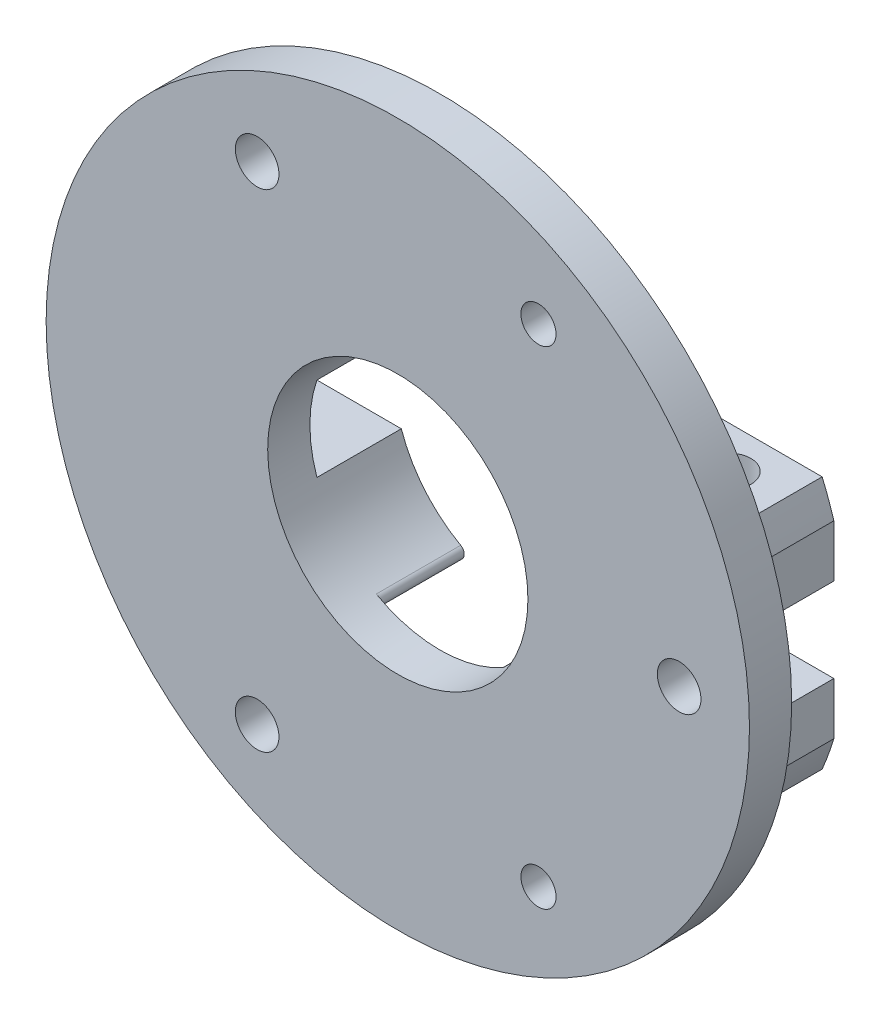
ISO-10303-21;
HEADER;
FILE_DESCRIPTION(('STEP AP214'),'2;1');
FILE_NAME('part.step','',(''),(''),'','','');
FILE_SCHEMA(('AUTOMOTIVE_DESIGN { 1 0 10303 214 1 1 1 1 }'));
ENDSEC;
DATA;
#1=APPLICATION_CONTEXT('core data for automotive mechanical design processes');
#2=APPLICATION_PROTOCOL_DEFINITION('international standard','automotive_design',2000,#1);
#3=PRODUCT_CONTEXT('',#1,'mechanical');
#4=PRODUCT('Part','Part','',(#3));
#5=PRODUCT_RELATED_PRODUCT_CATEGORY('part','',(#4));
#6=PRODUCT_DEFINITION_FORMATION('','',#4);
#7=PRODUCT_DEFINITION_CONTEXT('part definition',#1,'design');
#8=PRODUCT_DEFINITION('design','',#6,#7);
#9=PRODUCT_DEFINITION_SHAPE('','',#8);
#10=(LENGTH_UNIT() NAMED_UNIT(*) SI_UNIT(.MILLI.,.METRE.));
#11=(NAMED_UNIT(*) PLANE_ANGLE_UNIT() SI_UNIT($,.RADIAN.));
#12=(NAMED_UNIT(*) SI_UNIT($,.STERADIAN.) SOLID_ANGLE_UNIT());
#13=UNCERTAINTY_MEASURE_WITH_UNIT(LENGTH_MEASURE(1.E-05),#10,'distance_accuracy_value','');
#14=(GEOMETRIC_REPRESENTATION_CONTEXT(3) GLOBAL_UNCERTAINTY_ASSIGNED_CONTEXT((#13)) GLOBAL_UNIT_ASSIGNED_CONTEXT((#10,
#11,#12)) REPRESENTATION_CONTEXT('',''));
#15=CARTESIAN_POINT('',(0.,0.,0.));
#16=DIRECTION('',(0.,0.,1.));
#17=DIRECTION('',(1.,0.,0.));
#18=AXIS2_PLACEMENT_3D('',#15,#16,#17);
#19=CARTESIAN_POINT('',(0.,0.,0.));
#20=DIRECTION('',(0.,0.,1.));
#21=DIRECTION('',(1.,0.,0.));
#22=AXIS2_PLACEMENT_3D('',#19,#20,#21);
#23=PLANE('',#22);
#24=CARTESIAN_POINT('',(0.,0.,0.));
#25=DIRECTION('',(0.,0.,1.));
#26=DIRECTION('',(1.,0.,0.));
#27=AXIS2_PLACEMENT_3D('',#24,#25,#26);
#28=CIRCLE('',#27,9.25);
#29=CARTESIAN_POINT('',(8.7500000000059,-2.99999999998279,0.));
#30=VERTEX_POINT('',#29);
#31=CARTESIAN_POINT('',(8.7499999999939,3.00000000001778,0.));
#32=VERTEX_POINT('',#31);
#33=EDGE_CURVE('E381',#30,#32,#28,.T.);
#34=ORIENTED_EDGE('',*,*,#33,.T.);
#35=DIRECTION('',(-1.,0.,0.));
#36=VECTOR('',#35,1.);
#37=CARTESIAN_POINT('',(0.,3.00000000001778,0.));
#38=LINE('',#37,#36);
#39=CARTESIAN_POINT('',(21.9999999999959,3.00000000001778,0.));
#40=VERTEX_POINT('',#39);
#41=EDGE_CURVE('E211',#40,#32,#38,.T.);
#42=ORIENTED_EDGE('',*,*,#41,.F.);
#43=DIRECTION('',(0.,-1.,0.));
#44=VECTOR('',#43,1.);
#45=CARTESIAN_POINT('',(21.9999999999959,0.,0.));
#46=LINE('',#45,#44);
#47=CARTESIAN_POINT('',(21.9999999999959,6.70820393251295,0.));
#48=VERTEX_POINT('',#47);
#49=EDGE_CURVE('E204',#48,#40,#46,.T.);
#50=ORIENTED_EDGE('',*,*,#49,.F.);
#51=CARTESIAN_POINT('',(0.,0.,0.));
#52=DIRECTION('',(0.,0.,1.));
#53=DIRECTION('',(1.,0.,0.));
#54=AXIS2_PLACEMENT_3D('',#51,#52,#53);
#55=CIRCLE('',#54,23.);
#56=CARTESIAN_POINT('',(21.1660104885105,9.00000000001463,0.));
#57=VERTEX_POINT('',#56);
#58=EDGE_CURVE('E210',#48,#57,#55,.T.);
#59=ORIENTED_EDGE('',*,*,#58,.T.);
#60=DIRECTION('',(1.,0.,0.));
#61=VECTOR('',#60,1.);
#62=CARTESIAN_POINT('',(0.,9.00000000001463,0.));
#63=LINE('',#62,#61);
#64=CARTESIAN_POINT('',(4.77624329360967,9.00000000001463,0.));
#65=VERTEX_POINT('',#64);
#66=EDGE_CURVE('E366',#65,#57,#63,.T.);
#67=ORIENTED_EDGE('',*,*,#66,.F.);
#68=CARTESIAN_POINT('',(4.77624329360967,8.50000000001463,0.));
#69=DIRECTION('',(0.,0.,1.));
#70=DIRECTION('',(1.,0.,0.));
#71=AXIS2_PLACEMENT_3D('',#68,#69,#70);
#72=CIRCLE('',#71,0.5);
#73=CARTESIAN_POINT('',(4.53130774009123,8.06410256411644,0.));
#74=VERTEX_POINT('',#73);
#75=EDGE_CURVE('E51',#65,#74,#72,.T.);
#76=ORIENTED_EDGE('',*,*,#75,.T.);
#77=CARTESIAN_POINT('',(-4.53130774009123,8.06410256411644,0.));
#78=VERTEX_POINT('',#77);
#79=EDGE_CURVE('E384',#74,#78,#28,.T.);
#80=ORIENTED_EDGE('',*,*,#79,.T.);
#81=CARTESIAN_POINT('',(-4.77624329360967,8.50000000001463,0.));
#82=DIRECTION('',(0.,0.,1.));
#83=DIRECTION('',(1.,0.,0.));
#84=AXIS2_PLACEMENT_3D('',#81,#82,#83);
#85=CIRCLE('',#84,0.5);
#86=CARTESIAN_POINT('',(-4.77624329360967,9.00000000001463,0.));
#87=VERTEX_POINT('',#86);
#88=EDGE_CURVE('E423',#78,#87,#85,.T.);
#89=ORIENTED_EDGE('',*,*,#88,.T.);
#90=DIRECTION('',(1.,0.,0.));
#91=VECTOR('',#90,1.);
#92=CARTESIAN_POINT('',(0.,9.00000000001463,0.));
#93=LINE('',#92,#91);
#94=CARTESIAN_POINT('',(-21.1660104885105,9.00000000001463,0.));
#95=VERTEX_POINT('',#94);
#96=EDGE_CURVE('E345',#95,#87,#93,.T.);
#97=ORIENTED_EDGE('',*,*,#96,.F.);
#98=CARTESIAN_POINT('',(-22.0000000000035,6.70820393248783,0.));
#99=VERTEX_POINT('',#98);
#100=EDGE_CURVE('E234',#95,#99,#55,.T.);
#101=ORIENTED_EDGE('',*,*,#100,.T.);
#102=DIRECTION('',(0.,-1.,0.));
#103=VECTOR('',#102,1.);
#104=CARTESIAN_POINT('',(-22.0000000000035,0.,0.));
#105=LINE('',#104,#103);
#106=CARTESIAN_POINT('',(-22.0000000000035,3.00000000001778,0.));
#107=VERTEX_POINT('',#106);
#108=EDGE_CURVE('E355',#99,#107,#105,.T.);
#109=ORIENTED_EDGE('',*,*,#108,.T.);
#110=DIRECTION('',(-1.,0.,0.));
#111=VECTOR('',#110,1.);
#112=CARTESIAN_POINT('',(0.,3.00000000001778,0.));
#113=LINE('',#112,#111);
#114=CARTESIAN_POINT('',(-8.7499999999939,3.00000000001778,0.));
#115=VERTEX_POINT('',#114);
#116=EDGE_CURVE('E341',#115,#107,#113,.T.);
#117=ORIENTED_EDGE('',*,*,#116,.F.);
#118=CARTESIAN_POINT('',(-8.7500000000059,-2.99999999998279,0.));
#119=VERTEX_POINT('',#118);
#120=EDGE_CURVE('E386',#115,#119,#28,.T.);
#121=ORIENTED_EDGE('',*,*,#120,.T.);
#122=DIRECTION('',(-1.,0.,0.));
#123=VECTOR('',#122,1.);
#124=CARTESIAN_POINT('',(0.,-2.99999999998279,0.));
#125=LINE('',#124,#123);
#126=CARTESIAN_POINT('',(-22.0000000000035,-2.99999999998279,0.));
#127=VERTEX_POINT('',#126);
#128=EDGE_CURVE('E320',#119,#127,#125,.T.);
#129=ORIENTED_EDGE('',*,*,#128,.T.);
#130=DIRECTION('',(0.,-1.,0.));
#131=VECTOR('',#130,1.);
#132=CARTESIAN_POINT('',(-22.0000000000035,0.,0.));
#133=LINE('',#132,#131);
#134=CARTESIAN_POINT('',(-22.0000000000035,-6.70820393248783,0.));
#135=VERTEX_POINT('',#134);
#136=EDGE_CURVE('E332',#127,#135,#133,.T.);
#137=ORIENTED_EDGE('',*,*,#136,.T.);
#138=CARTESIAN_POINT('',(-21.1660104885235,-8.99999999998418,0.));
#139=VERTEX_POINT('',#138);
#140=EDGE_CURVE('E231',#135,#139,#55,.T.);
#141=ORIENTED_EDGE('',*,*,#140,.T.);
#142=DIRECTION('',(1.,0.,0.));
#143=VECTOR('',#142,1.);
#144=CARTESIAN_POINT('',(0.,-8.99999999998418,0.));
#145=LINE('',#144,#143);
#146=CARTESIAN_POINT('',(-4.77624329366386,-8.99999999998418,0.));
#147=VERTEX_POINT('',#146);
#148=EDGE_CURVE('E316',#139,#147,#145,.T.);
#149=ORIENTED_EDGE('',*,*,#148,.T.);
#150=CARTESIAN_POINT('',(-4.77624329366386,-8.49999999998418,0.));
#151=DIRECTION('',(0.,0.,1.));
#152=DIRECTION('',(1.,0.,0.));
#153=AXIS2_PLACEMENT_3D('',#150,#151,#152);
#154=CIRCLE('',#153,0.5);
#155=CARTESIAN_POINT('',(-4.53130774014263,-8.06410256408755,0.));
#156=VERTEX_POINT('',#155);
#157=EDGE_CURVE('E420',#147,#156,#154,.T.);
#158=ORIENTED_EDGE('',*,*,#157,.T.);
#159=CARTESIAN_POINT('',(4.53130774014263,-8.06410256408755,0.));
#160=VERTEX_POINT('',#159);
#161=EDGE_CURVE('E445',#156,#160,#28,.T.);
#162=ORIENTED_EDGE('',*,*,#161,.T.);
#163=CARTESIAN_POINT('',(4.77624329366386,-8.49999999998418,0.));
#164=DIRECTION('',(0.,0.,1.));
#165=DIRECTION('',(1.,0.,0.));
#166=AXIS2_PLACEMENT_3D('',#163,#164,#165);
#167=CIRCLE('',#166,0.5);
#168=CARTESIAN_POINT('',(4.77624329366386,-8.99999999998418,0.));
#169=VERTEX_POINT('',#168);
#170=EDGE_CURVE('E418',#160,#169,#167,.T.);
#171=ORIENTED_EDGE('',*,*,#170,.T.);
#172=DIRECTION('',(1.,0.,0.));
#173=VECTOR('',#172,1.);
#174=CARTESIAN_POINT('',(0.,-8.99999999998418,0.));
#175=LINE('',#174,#173);
#176=CARTESIAN_POINT('',(21.1660104885235,-8.99999999998418,0.));
#177=VERTEX_POINT('',#176);
#178=EDGE_CURVE('E253',#169,#177,#175,.T.);
#179=ORIENTED_EDGE('',*,*,#178,.T.);
#180=CARTESIAN_POINT('',(21.9999999999959,-6.70820393251295,0.));
#181=VERTEX_POINT('',#180);
#182=EDGE_CURVE('E236',#177,#181,#55,.T.);
#183=ORIENTED_EDGE('',*,*,#182,.T.);
#184=DIRECTION('',(0.,-1.,0.));
#185=VECTOR('',#184,1.);
#186=CARTESIAN_POINT('',(21.9999999999959,0.,0.));
#187=LINE('',#186,#185);
#188=CARTESIAN_POINT('',(21.9999999999959,-2.99999999998279,0.));
#189=VERTEX_POINT('',#188);
#190=EDGE_CURVE('E250',#189,#181,#187,.T.);
#191=ORIENTED_EDGE('',*,*,#190,.F.);
#192=DIRECTION('',(-1.,0.,0.));
#193=VECTOR('',#192,1.);
#194=CARTESIAN_POINT('',(0.,-2.99999999998279,0.));
#195=LINE('',#194,#193);
#196=EDGE_CURVE('E298',#189,#30,#195,.T.);
#197=ORIENTED_EDGE('',*,*,#196,.T.);
#198=EDGE_LOOP('',(#34,#42,#50,#59,#67,#76,#80,#89,#97,#101,#109,#117,#121,#129,#137,#141,#149,
#158,#162,#171,#179,#183,#191,#197));
#199=FACE_BOUND('',#198,.T.);
#200=CARTESIAN_POINT('',(20.,0.,0.));
#201=DIRECTION('',(0.,0.,-1.));
#202=DIRECTION('',(-1.,0.,0.));
#203=AXIS2_PLACEMENT_3D('',#200,#201,#202);
#204=CIRCLE('',#203,1.55);
#205=CARTESIAN_POINT('',(18.45,0.,0.));
#206=VERTEX_POINT('',#205);
#207=EDGE_CURVE('E606',#206,#206,#204,.T.);
#208=ORIENTED_EDGE('',*,*,#207,.F.);
#209=EDGE_LOOP('',(#208));
#210=FACE_BOUND('',#209,.T.);
#211=CARTESIAN_POINT('',(9.99999999999984,-17.3205080756889,0.));
#212=DIRECTION('',(0.,0.,-1.));
#213=DIRECTION('',(-1.,0.,0.));
#214=AXIS2_PLACEMENT_3D('',#211,#212,#213);
#215=CIRCLE('',#214,1.24999999999999);
#216=CARTESIAN_POINT('',(8.74999999999985,-17.3205080756889,0.));
#217=VERTEX_POINT('',#216);
#218=EDGE_CURVE('E600',#217,#217,#215,.T.);
#219=ORIENTED_EDGE('',*,*,#218,.F.);
#220=EDGE_LOOP('',(#219));
#221=FACE_BOUND('',#220,.T.);
#222=CARTESIAN_POINT('',(0.,0.,0.));
#223=DIRECTION('',(0.,0.,1.));
#224=DIRECTION('',(1.,0.,0.));
#225=AXIS2_PLACEMENT_3D('',#222,#223,#224);
#226=CIRCLE('',#225,25.);
#227=CARTESIAN_POINT('',(25.,0.,0.));
#228=VERTEX_POINT('',#227);
#229=EDGE_CURVE('E238',#228,#228,#226,.T.);
#230=ORIENTED_EDGE('',*,*,#229,.F.);
#231=EDGE_LOOP('',(#230));
#232=FACE_BOUND('',#231,.T.);
#233=CARTESIAN_POINT('',(-10.0000000000001,17.3205080756887,0.));
#234=DIRECTION('',(0.,0.,-1.));
#235=DIRECTION('',(-1.,0.,0.));
#236=AXIS2_PLACEMENT_3D('',#233,#234,#235);
#237=CIRCLE('',#236,1.55);
#238=CARTESIAN_POINT('',(-11.5500000000001,17.3205080756887,0.));
#239=VERTEX_POINT('',#238);
#240=EDGE_CURVE('E593',#239,#239,#237,.T.);
#241=ORIENTED_EDGE('',*,*,#240,.F.);
#242=EDGE_LOOP('',(#241));
#243=FACE_BOUND('',#242,.T.);
#244=CARTESIAN_POINT('',(-9.99999999999984,-17.3205080756889,0.));
#245=DIRECTION('',(0.,0.,-1.));
#246=DIRECTION('',(-1.,0.,0.));
#247=AXIS2_PLACEMENT_3D('',#244,#245,#246);
#248=CIRCLE('',#247,1.55);
#249=CARTESIAN_POINT('',(-11.5499999999998,-17.3205080756889,0.));
#250=VERTEX_POINT('',#249);
#251=EDGE_CURVE('E596',#250,#250,#248,.T.);
#252=ORIENTED_EDGE('',*,*,#251,.F.);
#253=EDGE_LOOP('',(#252));
#254=FACE_BOUND('',#253,.T.);
#255=CARTESIAN_POINT('',(9.99999999999984,17.3205080756889,0.));
#256=DIRECTION('',(0.,0.,-1.));
#257=DIRECTION('',(-1.,0.,0.));
#258=AXIS2_PLACEMENT_3D('',#255,#256,#257);
#259=CIRCLE('',#258,1.24999999999999);
#260=CARTESIAN_POINT('',(8.74999999999985,17.3205080756889,0.));
#261=VERTEX_POINT('',#260);
#262=EDGE_CURVE('E603',#261,#261,#259,.T.);
#263=ORIENTED_EDGE('',*,*,#262,.F.);
#264=EDGE_LOOP('',(#263));
#265=FACE_BOUND('',#264,.T.);
#266=ADVANCED_FACE('F42',(#199,#210,#221,#232,#243,#254,#265),#23,.F.);
#267=CARTESIAN_POINT('',(0.,0.,3.));
#268=DIRECTION('',(0.,0.,-1.));
#269=DIRECTION('',(-1.,0.,0.));
#270=AXIS2_PLACEMENT_3D('',#267,#268,#269);
#271=CYLINDRICAL_SURFACE('',#270,23.);
#272=ORIENTED_EDGE('',*,*,#58,.F.);
#273=DIRECTION('',(0.,0.,-1.));
#274=VECTOR('',#273,1.);
#275=CARTESIAN_POINT('',(21.9999999999959,6.70820393251295,4.));
#276=LINE('',#275,#274);
#277=CARTESIAN_POINT('',(21.9999999999959,6.70820393251295,-6.));
#278=VERTEX_POINT('',#277);
#279=EDGE_CURVE('E219',#48,#278,#276,.T.);
#280=ORIENTED_EDGE('',*,*,#279,.T.);
#281=CARTESIAN_POINT('',(0.,0.,-6.));
#282=DIRECTION('',(0.,0.,-1.));
#283=DIRECTION('',(-1.,0.,0.));
#284=AXIS2_PLACEMENT_3D('',#281,#282,#283);
#285=CIRCLE('',#284,23.);
#286=CARTESIAN_POINT('',(21.1660104885105,9.00000000001463,-6.));
#287=VERTEX_POINT('',#286);
#288=EDGE_CURVE('E245',#287,#278,#285,.T.);
#289=ORIENTED_EDGE('',*,*,#288,.F.);
#290=DIRECTION('',(0.,0.,-1.));
#291=VECTOR('',#290,1.);
#292=CARTESIAN_POINT('',(21.1660104885105,9.00000000001463,4.));
#293=LINE('',#292,#291);
#294=EDGE_CURVE('E229',#287,#57,#293,.F.);
#295=ORIENTED_EDGE('',*,*,#294,.T.);
#296=EDGE_LOOP('',(#272,#280,#289,#295));
#297=FACE_BOUND('',#296,.T.);
#298=ADVANCED_FACE('F227',(#297),#271,.T.);
#299=ORIENTED_EDGE('',*,*,#100,.F.);
#300=DIRECTION('',(0.,0.,-1.));
#301=VECTOR('',#300,1.);
#302=CARTESIAN_POINT('',(-21.1660104885105,9.00000000001463,4.));
#303=LINE('',#302,#301);
#304=CARTESIAN_POINT('',(-21.1660104885105,9.00000000001463,-6.));
#305=VERTEX_POINT('',#304);
#306=EDGE_CURVE('E58',#95,#305,#303,.T.);
#307=ORIENTED_EDGE('',*,*,#306,.T.);
#308=CARTESIAN_POINT('',(-22.0000000000035,6.70820393248783,-6.));
#309=VERTEX_POINT('',#308);
#310=EDGE_CURVE('E246',#309,#305,#285,.T.);
#311=ORIENTED_EDGE('',*,*,#310,.F.);
#312=DIRECTION('',(0.,0.,-1.));
#313=VECTOR('',#312,1.);
#314=CARTESIAN_POINT('',(-22.0000000000035,6.70820393248783,4.));
#315=LINE('',#314,#313);
#316=EDGE_CURVE('E225',#99,#309,#315,.T.);
#317=ORIENTED_EDGE('',*,*,#316,.F.);
#318=EDGE_LOOP('',(#299,#307,#311,#317));
#319=FACE_BOUND('',#318,.T.);
#320=ADVANCED_FACE('F498',(#319),#271,.T.);
#321=ORIENTED_EDGE('',*,*,#140,.F.);
#322=DIRECTION('',(0.,0.,-1.));
#323=VECTOR('',#322,1.);
#324=CARTESIAN_POINT('',(-22.0000000000035,-6.70820393248783,4.));
#325=LINE('',#324,#323);
#326=CARTESIAN_POINT('',(-22.0000000000035,-6.70820393248783,-6.));
#327=VERTEX_POINT('',#326);
#328=EDGE_CURVE('E66',#327,#135,#325,.F.);
#329=ORIENTED_EDGE('',*,*,#328,.F.);
#330=CARTESIAN_POINT('',(-21.1660104885235,-8.99999999998418,-6.));
#331=VERTEX_POINT('',#330);
#332=EDGE_CURVE('E243',#331,#327,#285,.T.);
#333=ORIENTED_EDGE('',*,*,#332,.F.);
#334=DIRECTION('',(0.,0.,-1.));
#335=VECTOR('',#334,1.);
#336=CARTESIAN_POINT('',(-21.1660104885235,-8.99999999998418,4.));
#337=LINE('',#336,#335);
#338=EDGE_CURVE('E271',#139,#331,#337,.T.);
#339=ORIENTED_EDGE('',*,*,#338,.F.);
#340=EDGE_LOOP('',(#321,#329,#333,#339));
#341=FACE_BOUND('',#340,.T.);
#342=ADVANCED_FACE('F471',(#341),#271,.T.);
#343=ORIENTED_EDGE('',*,*,#182,.F.);
#344=DIRECTION('',(0.,0.,-1.));
#345=VECTOR('',#344,1.);
#346=CARTESIAN_POINT('',(21.1660104885235,-8.99999999998418,4.));
#347=LINE('',#346,#345);
#348=CARTESIAN_POINT('',(21.1660104885235,-8.99999999998418,-6.));
#349=VERTEX_POINT('',#348);
#350=EDGE_CURVE('E257',#349,#177,#347,.F.);
#351=ORIENTED_EDGE('',*,*,#350,.F.);
#352=CARTESIAN_POINT('',(0.,0.,-6.));
#353=DIRECTION('',(0.,0.,-1.));
#354=DIRECTION('',(-1.,0.,0.));
#355=AXIS2_PLACEMENT_3D('',#352,#353,#354);
#356=CIRCLE('',#355,23.);
#357=CARTESIAN_POINT('',(21.9999999999959,-6.70820393251295,-6.));
#358=VERTEX_POINT('',#357);
#359=EDGE_CURVE('E11',#358,#349,#356,.T.);
#360=ORIENTED_EDGE('',*,*,#359,.F.);
#361=DIRECTION('',(0.,0.,-1.));
#362=VECTOR('',#361,1.);
#363=CARTESIAN_POINT('',(21.9999999999959,-6.70820393251295,4.));
#364=LINE('',#363,#362);
#365=EDGE_CURVE('E259',#358,#181,#364,.F.);
#366=ORIENTED_EDGE('',*,*,#365,.T.);
#367=EDGE_LOOP('',(#343,#351,#360,#366));
#368=FACE_BOUND('',#367,.T.);
#369=ADVANCED_FACE('F256',(#368),#271,.T.);
#370=CARTESIAN_POINT('',(21.9999999999959,0.,-6.));
#371=DIRECTION('',(-1.,0.,0.));
#372=DIRECTION('',(0.,0.,1.));
#373=AXIS2_PLACEMENT_3D('',#370,#371,#372);
#374=PLANE('',#373);
#375=ORIENTED_EDGE('',*,*,#279,.F.);
#376=ORIENTED_EDGE('',*,*,#49,.T.);
#377=DIRECTION('',(0.,0.,1.));
#378=VECTOR('',#377,1.);
#379=CARTESIAN_POINT('',(21.9999999999959,3.00000000001778,-6.));
#380=LINE('',#379,#378);
#381=CARTESIAN_POINT('',(21.9999999999959,3.00000000001778,-6.));
#382=VERTEX_POINT('',#381);
#383=EDGE_CURVE('E379',#382,#40,#380,.T.);
#384=ORIENTED_EDGE('',*,*,#383,.F.);
#385=DIRECTION('',(0.,-1.,0.));
#386=VECTOR('',#385,1.);
#387=CARTESIAN_POINT('',(21.9999999999959,0.,-6.));
#388=LINE('',#387,#386);
#389=EDGE_CURVE('E221',#278,#382,#388,.T.);
#390=ORIENTED_EDGE('',*,*,#389,.F.);
#391=EDGE_LOOP('',(#375,#376,#384,#390));
#392=FACE_BOUND('',#391,.T.);
#393=ADVANCED_FACE('F220',(#392),#374,.F.);
#394=CARTESIAN_POINT('',(0.,9.00000000001463,-6.));
#395=DIRECTION('',(0.,-1.,0.));
#396=DIRECTION('',(0.,0.,-1.));
#397=AXIS2_PLACEMENT_3D('',#394,#395,#396);
#398=PLANE('',#397);
#399=CARTESIAN_POINT('',(17.5,9.00000000001463,-3.));
#400=DIRECTION('',(0.,-1.,0.));
#401=DIRECTION('',(0.,0.,-1.));
#402=AXIS2_PLACEMENT_3D('',#399,#400,#401);
#403=CIRCLE('',#402,1.6);
#404=CARTESIAN_POINT('',(17.5,9.00000000001463,-4.6));
#405=VERTEX_POINT('',#404);
#406=EDGE_CURVE('E285',#405,#405,#403,.T.);
#407=ORIENTED_EDGE('',*,*,#406,.T.);
#408=EDGE_LOOP('',(#407));
#409=FACE_BOUND('',#408,.T.);
#410=ORIENTED_EDGE('',*,*,#294,.F.);
#411=DIRECTION('',(1.,0.,0.));
#412=VECTOR('',#411,1.);
#413=CARTESIAN_POINT('',(0.,9.00000000001463,-6.));
#414=LINE('',#413,#412);
#415=CARTESIAN_POINT('',(4.77624329360967,9.00000000001463,-6.));
#416=VERTEX_POINT('',#415);
#417=EDGE_CURVE('E371',#416,#287,#414,.T.);
#418=ORIENTED_EDGE('',*,*,#417,.F.);
#419=DIRECTION('',(0.,0.,1.));
#420=VECTOR('',#419,1.);
#421=CARTESIAN_POINT('',(4.77624329360967,9.00000000001463,0.));
#422=LINE('',#421,#420);
#423=EDGE_CURVE('E413',#416,#65,#422,.T.);
#424=ORIENTED_EDGE('',*,*,#423,.T.);
#425=ORIENTED_EDGE('',*,*,#66,.T.);
#426=EDGE_LOOP('',(#410,#418,#424,#425));
#427=FACE_BOUND('',#426,.T.);
#428=ADVANCED_FACE('F548',(#409,#427),#398,.F.);
#429=CARTESIAN_POINT('',(0.,0.,-6.));
#430=DIRECTION('',(0.,0.,-1.));
#431=DIRECTION('',(-1.,0.,0.));
#432=AXIS2_PLACEMENT_3D('',#429,#430,#431);
#433=PLANE('',#432);
#434=ORIENTED_EDGE('',*,*,#417,.T.);
#435=ORIENTED_EDGE('',*,*,#288,.T.);
#436=ORIENTED_EDGE('',*,*,#389,.T.);
#437=DIRECTION('',(-1.,0.,0.));
#438=VECTOR('',#437,1.);
#439=CARTESIAN_POINT('',(0.,3.00000000001778,-6.));
#440=LINE('',#439,#438);
#441=CARTESIAN_POINT('',(8.7499999999939,3.00000000001778,-6.));
#442=VERTEX_POINT('',#441);
#443=EDGE_CURVE('E365',#382,#442,#440,.T.);
#444=ORIENTED_EDGE('',*,*,#443,.T.);
#445=CARTESIAN_POINT('',(0.,0.,-6.));
#446=DIRECTION('',(0.,0.,-1.));
#447=DIRECTION('',(-1.,0.,0.));
#448=AXIS2_PLACEMENT_3D('',#445,#446,#447);
#449=CIRCLE('',#448,9.25);
#450=CARTESIAN_POINT('',(4.53130774009123,8.06410256411644,-6.));
#451=VERTEX_POINT('',#450);
#452=EDGE_CURVE('E368',#442,#451,#449,.F.);
#453=ORIENTED_EDGE('',*,*,#452,.T.);
#454=CARTESIAN_POINT('',(4.77624329360967,8.50000000001463,-6.));
#455=DIRECTION('',(0.,0.,-1.));
#456=DIRECTION('',(-1.,0.,0.));
#457=AXIS2_PLACEMENT_3D('',#454,#455,#456);
#458=CIRCLE('',#457,0.5);
#459=EDGE_CURVE('E416',#451,#416,#458,.T.);
#460=ORIENTED_EDGE('',*,*,#459,.T.);
#461=EDGE_LOOP('',(#434,#435,#436,#444,#453,#460));
#462=FACE_BOUND('',#461,.T.);
#463=ADVANCED_FACE('F436',(#462),#433,.T.);
#464=CARTESIAN_POINT('',(-22.0000000000035,0.,-6.));
#465=DIRECTION('',(-1.,0.,0.));
#466=DIRECTION('',(0.,0.,1.));
#467=AXIS2_PLACEMENT_3D('',#464,#465,#466);
#468=PLANE('',#467);
#469=ORIENTED_EDGE('',*,*,#108,.F.);
#470=ORIENTED_EDGE('',*,*,#316,.T.);
#471=DIRECTION('',(0.,-1.,0.));
#472=VECTOR('',#471,1.);
#473=CARTESIAN_POINT('',(-22.0000000000035,0.,-6.));
#474=LINE('',#473,#472);
#475=CARTESIAN_POINT('',(-22.0000000000035,3.00000000001778,-6.));
#476=VERTEX_POINT('',#475);
#477=EDGE_CURVE('E348',#309,#476,#474,.T.);
#478=ORIENTED_EDGE('',*,*,#477,.T.);
#479=DIRECTION('',(0.,0.,1.));
#480=VECTOR('',#479,1.);
#481=CARTESIAN_POINT('',(-22.0000000000035,3.00000000001778,-6.));
#482=LINE('',#481,#480);
#483=EDGE_CURVE('E352',#476,#107,#482,.T.);
#484=ORIENTED_EDGE('',*,*,#483,.T.);
#485=EDGE_LOOP('',(#469,#470,#478,#484));
#486=FACE_BOUND('',#485,.T.);
#487=ADVANCED_FACE('F529',(#486),#468,.T.);
#488=CARTESIAN_POINT('',(0.,9.00000000001463,-6.));
#489=DIRECTION('',(0.,-1.,0.));
#490=DIRECTION('',(0.,0.,-1.));
#491=AXIS2_PLACEMENT_3D('',#488,#489,#490);
#492=PLANE('',#491);
#493=CARTESIAN_POINT('',(-17.5,9.00000000001463,-3.));
#494=DIRECTION('',(0.,-1.,0.));
#495=DIRECTION('',(0.,0.,-1.));
#496=AXIS2_PLACEMENT_3D('',#493,#494,#495);
#497=CIRCLE('',#496,1.6);
#498=CARTESIAN_POINT('',(-17.5,9.00000000001463,-4.6));
#499=VERTEX_POINT('',#498);
#500=EDGE_CURVE('E292',#499,#499,#497,.T.);
#501=ORIENTED_EDGE('',*,*,#500,.T.);
#502=EDGE_LOOP('',(#501));
#503=FACE_BOUND('',#502,.T.);
#504=ORIENTED_EDGE('',*,*,#306,.F.);
#505=ORIENTED_EDGE('',*,*,#96,.T.);
#506=DIRECTION('',(0.,0.,1.));
#507=VECTOR('',#506,1.);
#508=CARTESIAN_POINT('',(-4.77624329360967,9.00000000001463,-6.));
#509=LINE('',#508,#507);
#510=CARTESIAN_POINT('',(-4.77624329360967,9.00000000001463,-6.));
#511=VERTEX_POINT('',#510);
#512=EDGE_CURVE('E408',#87,#511,#509,.F.);
#513=ORIENTED_EDGE('',*,*,#512,.T.);
#514=DIRECTION('',(1.,0.,0.));
#515=VECTOR('',#514,1.);
#516=CARTESIAN_POINT('',(0.,9.00000000001463,-6.));
#517=LINE('',#516,#515);
#518=EDGE_CURVE('E350',#305,#511,#517,.T.);
#519=ORIENTED_EDGE('',*,*,#518,.F.);
#520=EDGE_LOOP('',(#504,#505,#513,#519));
#521=FACE_BOUND('',#520,.T.);
#522=ADVANCED_FACE('F531',(#503,#521),#492,.F.);
#523=CARTESIAN_POINT('',(0.,0.,-6.));
#524=DIRECTION('',(0.,0.,-1.));
#525=DIRECTION('',(-1.,0.,0.));
#526=AXIS2_PLACEMENT_3D('',#523,#524,#525);
#527=PLANE('',#526);
#528=ORIENTED_EDGE('',*,*,#477,.F.);
#529=ORIENTED_EDGE('',*,*,#310,.T.);
#530=ORIENTED_EDGE('',*,*,#518,.T.);
#531=CARTESIAN_POINT('',(-4.77624329360967,8.50000000001463,-6.));
#532=DIRECTION('',(0.,0.,-1.));
#533=DIRECTION('',(-1.,0.,0.));
#534=AXIS2_PLACEMENT_3D('',#531,#532,#533);
#535=CIRCLE('',#534,0.5);
#536=CARTESIAN_POINT('',(-4.53130774009123,8.06410256411644,-6.));
#537=VERTEX_POINT('',#536);
#538=EDGE_CURVE('E411',#511,#537,#535,.T.);
#539=ORIENTED_EDGE('',*,*,#538,.T.);
#540=CARTESIAN_POINT('',(0.,0.,-6.));
#541=DIRECTION('',(0.,0.,-1.));
#542=DIRECTION('',(-1.,0.,0.));
#543=AXIS2_PLACEMENT_3D('',#540,#541,#542);
#544=CIRCLE('',#543,9.25);
#545=CARTESIAN_POINT('',(-8.7499999999939,3.00000000001778,-6.));
#546=VERTEX_POINT('',#545);
#547=EDGE_CURVE('E342',#537,#546,#544,.F.);
#548=ORIENTED_EDGE('',*,*,#547,.T.);
#549=DIRECTION('',(-1.,0.,0.));
#550=VECTOR('',#549,1.);
#551=CARTESIAN_POINT('',(0.,3.00000000001778,-6.));
#552=LINE('',#551,#550);
#553=EDGE_CURVE('E344',#546,#476,#552,.T.);
#554=ORIENTED_EDGE('',*,*,#553,.T.);
#555=EDGE_LOOP('',(#528,#529,#530,#539,#548,#554));
#556=FACE_BOUND('',#555,.T.);
#557=ADVANCED_FACE('F521',(#556),#527,.T.);
#558=CARTESIAN_POINT('',(0.,-8.99999999998418,-6.));
#559=DIRECTION('',(0.,-1.,0.));
#560=DIRECTION('',(0.,0.,-1.));
#561=AXIS2_PLACEMENT_3D('',#558,#559,#560);
#562=PLANE('',#561);
#563=CARTESIAN_POINT('',(-17.5,-8.99999999998418,-3.));
#564=DIRECTION('',(0.,-1.,0.));
#565=DIRECTION('',(0.,0.,-1.));
#566=AXIS2_PLACEMENT_3D('',#563,#564,#565);
#567=CIRCLE('',#566,1.6);
#568=CARTESIAN_POINT('',(-17.5,-8.99999999998418,-4.6));
#569=VERTEX_POINT('',#568);
#570=EDGE_CURVE('E277',#569,#569,#567,.T.);
#571=ORIENTED_EDGE('',*,*,#570,.F.);
#572=EDGE_LOOP('',(#571));
#573=FACE_BOUND('',#572,.T.);
#574=ORIENTED_EDGE('',*,*,#148,.F.);
#575=ORIENTED_EDGE('',*,*,#338,.T.);
#576=DIRECTION('',(1.,0.,0.));
#577=VECTOR('',#576,1.);
#578=CARTESIAN_POINT('',(0.,-8.99999999998418,-6.));
#579=LINE('',#578,#577);
#580=CARTESIAN_POINT('',(-4.77624329366386,-8.99999999998418,-6.));
#581=VERTEX_POINT('',#580);
#582=EDGE_CURVE('E317',#331,#581,#579,.T.);
#583=ORIENTED_EDGE('',*,*,#582,.T.);
#584=DIRECTION('',(0.,0.,-1.));
#585=VECTOR('',#584,1.);
#586=CARTESIAN_POINT('',(-4.77624329366386,-8.99999999998418,-6.));
#587=LINE('',#586,#585);
#588=EDGE_CURVE('E402',#581,#147,#587,.F.);
#589=ORIENTED_EDGE('',*,*,#588,.T.);
#590=EDGE_LOOP('',(#574,#575,#583,#589));
#591=FACE_BOUND('',#590,.T.);
#592=ADVANCED_FACE('F474',(#573,#591),#562,.T.);
#593=CARTESIAN_POINT('',(-22.0000000000035,0.,-6.));
#594=DIRECTION('',(-1.,0.,0.));
#595=DIRECTION('',(0.,0.,1.));
#596=AXIS2_PLACEMENT_3D('',#593,#594,#595);
#597=PLANE('',#596);
#598=DIRECTION('',(0.,-1.,0.));
#599=VECTOR('',#598,1.);
#600=CARTESIAN_POINT('',(-22.0000000000035,0.,-6.));
#601=LINE('',#600,#599);
#602=CARTESIAN_POINT('',(-22.0000000000035,-2.99999999998279,-6.));
#603=VERTEX_POINT('',#602);
#604=EDGE_CURVE('E319',#603,#327,#601,.T.);
#605=ORIENTED_EDGE('',*,*,#604,.T.);
#606=ORIENTED_EDGE('',*,*,#328,.T.);
#607=ORIENTED_EDGE('',*,*,#136,.F.);
#608=DIRECTION('',(0.,0.,1.));
#609=VECTOR('',#608,1.);
#610=CARTESIAN_POINT('',(-22.0000000000035,-2.99999999998279,-6.));
#611=LINE('',#610,#609);
#612=EDGE_CURVE('E338',#603,#127,#611,.T.);
#613=ORIENTED_EDGE('',*,*,#612,.F.);
#614=EDGE_LOOP('',(#605,#606,#607,#613));
#615=FACE_BOUND('',#614,.T.);
#616=ADVANCED_FACE('F469',(#615),#597,.T.);
#617=CARTESIAN_POINT('',(0.,0.,-6.));
#618=DIRECTION('',(0.,0.,-1.));
#619=DIRECTION('',(-1.,0.,0.));
#620=AXIS2_PLACEMENT_3D('',#617,#618,#619);
#621=PLANE('',#620);
#622=ORIENTED_EDGE('',*,*,#582,.F.);
#623=ORIENTED_EDGE('',*,*,#332,.T.);
#624=ORIENTED_EDGE('',*,*,#604,.F.);
#625=DIRECTION('',(-1.,0.,0.));
#626=VECTOR('',#625,1.);
#627=CARTESIAN_POINT('',(0.,-2.99999999998279,-6.));
#628=LINE('',#627,#626);
#629=CARTESIAN_POINT('',(-8.7500000000059,-2.99999999998279,-6.));
#630=VERTEX_POINT('',#629);
#631=EDGE_CURVE('E323',#630,#603,#628,.T.);
#632=ORIENTED_EDGE('',*,*,#631,.F.);
#633=CARTESIAN_POINT('',(0.,0.,-6.));
#634=DIRECTION('',(0.,0.,-1.));
#635=DIRECTION('',(-1.,0.,0.));
#636=AXIS2_PLACEMENT_3D('',#633,#634,#635);
#637=CIRCLE('',#636,9.25);
#638=CARTESIAN_POINT('',(-4.53130774014263,-8.06410256408755,-6.));
#639=VERTEX_POINT('',#638);
#640=EDGE_CURVE('E326',#630,#639,#637,.F.);
#641=ORIENTED_EDGE('',*,*,#640,.T.);
#642=CARTESIAN_POINT('',(-4.77624329366386,-8.49999999998418,-6.));
#643=DIRECTION('',(0.,0.,-1.));
#644=DIRECTION('',(-1.,0.,0.));
#645=AXIS2_PLACEMENT_3D('',#642,#643,#644);
#646=CIRCLE('',#645,0.5);
#647=EDGE_CURVE('E405',#639,#581,#646,.T.);
#648=ORIENTED_EDGE('',*,*,#647,.T.);
#649=EDGE_LOOP('',(#622,#623,#624,#632,#641,#648));
#650=FACE_BOUND('',#649,.T.);
#651=ADVANCED_FACE('F480',(#650),#621,.T.);
#652=CARTESIAN_POINT('',(21.9999999999959,0.,-6.));
#653=DIRECTION('',(-1.,0.,0.));
#654=DIRECTION('',(0.,0.,1.));
#655=AXIS2_PLACEMENT_3D('',#652,#653,#654);
#656=PLANE('',#655);
#657=ORIENTED_EDGE('',*,*,#365,.F.);
#658=DIRECTION('',(0.,-1.,0.));
#659=VECTOR('',#658,1.);
#660=CARTESIAN_POINT('',(21.9999999999959,0.,-6.));
#661=LINE('',#660,#659);
#662=CARTESIAN_POINT('',(21.9999999999959,-2.99999999998279,-6.));
#663=VERTEX_POINT('',#662);
#664=EDGE_CURVE('E302',#663,#358,#661,.T.);
#665=ORIENTED_EDGE('',*,*,#664,.F.);
#666=DIRECTION('',(0.,0.,1.));
#667=VECTOR('',#666,1.);
#668=CARTESIAN_POINT('',(21.9999999999959,-2.99999999998279,-6.));
#669=LINE('',#668,#667);
#670=EDGE_CURVE('E314',#663,#189,#669,.T.);
#671=ORIENTED_EDGE('',*,*,#670,.T.);
#672=ORIENTED_EDGE('',*,*,#190,.T.);
#673=EDGE_LOOP('',(#657,#665,#671,#672));
#674=FACE_BOUND('',#673,.T.);
#675=ADVANCED_FACE('F482',(#674),#656,.F.);
#676=CARTESIAN_POINT('',(0.,-8.99999999998418,-6.));
#677=DIRECTION('',(0.,-1.,0.));
#678=DIRECTION('',(0.,0.,-1.));
#679=AXIS2_PLACEMENT_3D('',#676,#677,#678);
#680=PLANE('',#679);
#681=CARTESIAN_POINT('',(17.5,-8.99999999998418,-3.));
#682=DIRECTION('',(0.,-1.,0.));
#683=DIRECTION('',(0.,0.,-1.));
#684=AXIS2_PLACEMENT_3D('',#681,#682,#683);
#685=CIRCLE('',#684,1.6);
#686=CARTESIAN_POINT('',(17.5,-8.99999999998418,-4.6));
#687=VERTEX_POINT('',#686);
#688=EDGE_CURVE('E224',#687,#687,#685,.T.);
#689=ORIENTED_EDGE('',*,*,#688,.F.);
#690=EDGE_LOOP('',(#689));
#691=FACE_BOUND('',#690,.T.);
#692=DIRECTION('',(1.,0.,0.));
#693=VECTOR('',#692,1.);
#694=CARTESIAN_POINT('',(0.,-8.99999999998418,-6.));
#695=LINE('',#694,#693);
#696=CARTESIAN_POINT('',(4.77624329366386,-8.99999999998418,-6.));
#697=VERTEX_POINT('',#696);
#698=EDGE_CURVE('E265',#697,#349,#695,.T.);
#699=ORIENTED_EDGE('',*,*,#698,.T.);
#700=ORIENTED_EDGE('',*,*,#350,.T.);
#701=ORIENTED_EDGE('',*,*,#178,.F.);
#702=DIRECTION('',(0.,0.,-1.));
#703=VECTOR('',#702,1.);
#704=CARTESIAN_POINT('',(4.77624329366386,-8.99999999998418,-6.));
#705=LINE('',#704,#703);
#706=EDGE_CURVE('E398',#169,#697,#705,.T.);
#707=ORIENTED_EDGE('',*,*,#706,.T.);
#708=EDGE_LOOP('',(#699,#700,#701,#707));
#709=FACE_BOUND('',#708,.T.);
#710=ADVANCED_FACE('F262',(#691,#709),#680,.T.);
#711=CARTESIAN_POINT('',(0.,0.,-6.));
#712=DIRECTION('',(0.,0.,-1.));
#713=DIRECTION('',(-1.,0.,0.));
#714=AXIS2_PLACEMENT_3D('',#711,#712,#713);
#715=PLANE('',#714);
#716=ORIENTED_EDGE('',*,*,#664,.T.);
#717=ORIENTED_EDGE('',*,*,#359,.T.);
#718=ORIENTED_EDGE('',*,*,#698,.F.);
#719=CARTESIAN_POINT('',(4.77624329366386,-8.49999999998418,-6.));
#720=DIRECTION('',(0.,0.,-1.));
#721=DIRECTION('',(-1.,0.,0.));
#722=AXIS2_PLACEMENT_3D('',#719,#720,#721);
#723=CIRCLE('',#722,0.5);
#724=CARTESIAN_POINT('',(4.53130774014263,-8.06410256408755,-6.));
#725=VERTEX_POINT('',#724);
#726=EDGE_CURVE('E400',#697,#725,#723,.T.);
#727=ORIENTED_EDGE('',*,*,#726,.T.);
#728=CARTESIAN_POINT('',(0.,0.,-6.));
#729=DIRECTION('',(0.,0.,-1.));
#730=DIRECTION('',(-1.,0.,0.));
#731=AXIS2_PLACEMENT_3D('',#728,#729,#730);
#732=CIRCLE('',#731,9.25);
#733=CARTESIAN_POINT('',(8.7500000000059,-2.99999999998279,-6.));
#734=VERTEX_POINT('',#733);
#735=EDGE_CURVE('E306',#725,#734,#732,.F.);
#736=ORIENTED_EDGE('',*,*,#735,.T.);
#737=DIRECTION('',(-1.,0.,0.));
#738=VECTOR('',#737,1.);
#739=CARTESIAN_POINT('',(0.,-2.99999999998279,-6.));
#740=LINE('',#739,#738);
#741=EDGE_CURVE('E299',#663,#734,#740,.T.);
#742=ORIENTED_EDGE('',*,*,#741,.F.);
#743=EDGE_LOOP('',(#716,#717,#718,#727,#736,#742));
#744=FACE_BOUND('',#743,.T.);
#745=ADVANCED_FACE('F452',(#744),#715,.T.);
#746=CARTESIAN_POINT('',(0.,0.,3.));
#747=DIRECTION('',(0.,0.,1.));
#748=DIRECTION('',(1.,0.,0.));
#749=AXIS2_PLACEMENT_3D('',#746,#747,#748);
#750=PLANE('',#749);
#751=CARTESIAN_POINT('',(9.99999999999984,17.3205080756889,3.));
#752=DIRECTION('',(0.,0.,1.));
#753=DIRECTION('',(1.,0.,0.));
#754=AXIS2_PLACEMENT_3D('',#751,#752,#753);
#755=CIRCLE('',#754,1.24999999999999);
#756=CARTESIAN_POINT('',(11.2499999999998,17.3205080756889,3.));
#757=VERTEX_POINT('',#756);
#758=EDGE_CURVE('E46',#757,#757,#755,.T.);
#759=ORIENTED_EDGE('',*,*,#758,.F.);
#760=EDGE_LOOP('',(#759));
#761=FACE_BOUND('',#760,.T.);
#762=CARTESIAN_POINT('',(9.99999999999984,-17.3205080756889,3.));
#763=DIRECTION('',(0.,0.,1.));
#764=DIRECTION('',(1.,0.,0.));
#765=AXIS2_PLACEMENT_3D('',#762,#763,#764);
#766=CIRCLE('',#765,1.24999999999999);
#767=CARTESIAN_POINT('',(11.2499999999998,-17.3205080756889,3.));
#768=VERTEX_POINT('',#767);
#769=EDGE_CURVE('E571',#768,#768,#766,.T.);
#770=ORIENTED_EDGE('',*,*,#769,.F.);
#771=EDGE_LOOP('',(#770));
#772=FACE_BOUND('',#771,.T.);
#773=CARTESIAN_POINT('',(-9.99999999999984,-17.3205080756889,3.));
#774=DIRECTION('',(0.,0.,1.));
#775=DIRECTION('',(-0.499999999999992,-0.866025403784443,0.));
#776=AXIS2_PLACEMENT_3D('',#773,#774,#775);
#777=CIRCLE('',#776,1.55);
#778=CARTESIAN_POINT('',(-10.7749999999998,-18.6628474515548,3.));
#779=VERTEX_POINT('',#778);
#780=EDGE_CURVE('E575',#779,#779,#777,.T.);
#781=ORIENTED_EDGE('',*,*,#780,.F.);
#782=EDGE_LOOP('',(#781));
#783=FACE_BOUND('',#782,.T.);
#784=CARTESIAN_POINT('',(-10.0000000000001,17.3205080756887,3.));
#785=DIRECTION('',(0.,0.,1.));
#786=DIRECTION('',(-0.500000000000004,0.866025403784436,0.));
#787=AXIS2_PLACEMENT_3D('',#784,#785,#786);
#788=CIRCLE('',#787,1.55);
#789=CARTESIAN_POINT('',(-10.7750000000001,18.6628474515546,3.));
#790=VERTEX_POINT('',#789);
#791=EDGE_CURVE('E579',#790,#790,#788,.T.);
#792=ORIENTED_EDGE('',*,*,#791,.F.);
#793=EDGE_LOOP('',(#792));
#794=FACE_BOUND('',#793,.T.);
#795=CARTESIAN_POINT('',(0.,0.,3.));
#796=DIRECTION('',(0.,0.,1.));
#797=DIRECTION('',(1.,0.,0.));
#798=AXIS2_PLACEMENT_3D('',#795,#796,#797);
#799=CIRCLE('',#798,9.25);
#800=CARTESIAN_POINT('',(9.25,0.,3.));
#801=VERTEX_POINT('',#800);
#802=EDGE_CURVE('E216',#801,#801,#799,.T.);
#803=ORIENTED_EDGE('',*,*,#802,.F.);
#804=EDGE_LOOP('',(#803));
#805=FACE_BOUND('',#804,.T.);
#806=CARTESIAN_POINT('',(0.,0.,3.));
#807=DIRECTION('',(0.,0.,1.));
#808=DIRECTION('',(1.,0.,0.));
#809=AXIS2_PLACEMENT_3D('',#806,#807,#808);
#810=CIRCLE('',#809,25.);
#811=CARTESIAN_POINT('',(25.,0.,3.));
#812=VERTEX_POINT('',#811);
#813=EDGE_CURVE('E232',#812,#812,#810,.T.);
#814=ORIENTED_EDGE('',*,*,#813,.T.);
#815=EDGE_LOOP('',(#814));
#816=FACE_BOUND('',#815,.T.);
#817=CARTESIAN_POINT('',(20.,0.,3.));
#818=DIRECTION('',(0.,0.,1.));
#819=DIRECTION('',(1.,0.,0.));
#820=AXIS2_PLACEMENT_3D('',#817,#818,#819);
#821=CIRCLE('',#820,1.55);
#822=CARTESIAN_POINT('',(21.55,0.,3.));
#823=VERTEX_POINT('',#822);
#824=EDGE_CURVE('E586',#823,#823,#821,.T.);
#825=ORIENTED_EDGE('',*,*,#824,.F.);
#826=EDGE_LOOP('',(#825));
#827=FACE_BOUND('',#826,.T.);
#828=ADVANCED_FACE('F501',(#761,#772,#783,#794,#805,#816,#827),#750,.T.);
#829=CARTESIAN_POINT('',(0.,0.,3.));
#830=DIRECTION('',(0.,0.,-1.));
#831=DIRECTION('',(-1.,0.,0.));
#832=AXIS2_PLACEMENT_3D('',#829,#830,#831);
#833=CYLINDRICAL_SURFACE('',#832,9.25);
#834=ORIENTED_EDGE('',*,*,#79,.F.);
#835=DIRECTION('',(0.,0.,-1.));
#836=VECTOR('',#835,1.);
#837=CARTESIAN_POINT('',(4.53130774009123,8.06410256411644,3.));
#838=LINE('',#837,#836);
#839=EDGE_CURVE('E215',#74,#451,#838,.T.);
#840=ORIENTED_EDGE('',*,*,#839,.T.);
#841=ORIENTED_EDGE('',*,*,#452,.F.);
#842=DIRECTION('',(0.,0.,1.));
#843=VECTOR('',#842,1.);
#844=CARTESIAN_POINT('',(8.7499999999939,3.00000000001778,-6.));
#845=LINE('',#844,#843);
#846=EDGE_CURVE('E373',#442,#32,#845,.T.);
#847=ORIENTED_EDGE('',*,*,#846,.T.);
#848=ORIENTED_EDGE('',*,*,#33,.F.);
#849=DIRECTION('',(0.,0.,1.));
#850=VECTOR('',#849,1.);
#851=CARTESIAN_POINT('',(8.7500000000059,-2.99999999998279,-6.));
#852=LINE('',#851,#850);
#853=EDGE_CURVE('E308',#734,#30,#852,.T.);
#854=ORIENTED_EDGE('',*,*,#853,.F.);
#855=ORIENTED_EDGE('',*,*,#735,.F.);
#856=DIRECTION('',(0.,0.,-1.));
#857=VECTOR('',#856,1.);
#858=CARTESIAN_POINT('',(4.53130774014263,-8.06410256408755,3.));
#859=LINE('',#858,#857);
#860=EDGE_CURVE('E395',#725,#160,#859,.F.);
#861=ORIENTED_EDGE('',*,*,#860,.T.);
#862=ORIENTED_EDGE('',*,*,#161,.F.);
#863=DIRECTION('',(0.,0.,-1.));
#864=VECTOR('',#863,1.);
#865=CARTESIAN_POINT('',(-4.53130774014263,-8.06410256408755,3.));
#866=LINE('',#865,#864);
#867=EDGE_CURVE('E393',#156,#639,#866,.T.);
#868=ORIENTED_EDGE('',*,*,#867,.T.);
#869=ORIENTED_EDGE('',*,*,#640,.F.);
#870=DIRECTION('',(0.,0.,1.));
#871=VECTOR('',#870,1.);
#872=CARTESIAN_POINT('',(-8.7500000000059,-2.99999999998279,-6.));
#873=LINE('',#872,#871);
#874=EDGE_CURVE('E329',#630,#119,#873,.T.);
#875=ORIENTED_EDGE('',*,*,#874,.T.);
#876=ORIENTED_EDGE('',*,*,#120,.F.);
#877=DIRECTION('',(0.,0.,1.));
#878=VECTOR('',#877,1.);
#879=CARTESIAN_POINT('',(-8.7499999999939,3.00000000001778,-6.));
#880=LINE('',#879,#878);
#881=EDGE_CURVE('E361',#546,#115,#880,.T.);
#882=ORIENTED_EDGE('',*,*,#881,.F.);
#883=ORIENTED_EDGE('',*,*,#547,.F.);
#884=DIRECTION('',(0.,0.,-1.));
#885=VECTOR('',#884,1.);
#886=CARTESIAN_POINT('',(-4.53130774009123,8.06410256411644,3.));
#887=LINE('',#886,#885);
#888=EDGE_CURVE('E390',#537,#78,#887,.F.);
#889=ORIENTED_EDGE('',*,*,#888,.T.);
#890=EDGE_LOOP('',(#834,#840,#841,#847,#848,#854,#855,#861,#862,#868,#869,#875,#876,#882,#883,#889));
#891=FACE_BOUND('',#890,.T.);
#892=ORIENTED_EDGE('',*,*,#802,.T.);
#893=EDGE_LOOP('',(#892));
#894=FACE_BOUND('',#893,.T.);
#895=ADVANCED_FACE('F433',(#891,#894),#833,.F.);
#896=CARTESIAN_POINT('',(0.,3.00000000001778,-6.));
#897=DIRECTION('',(0.,1.,0.));
#898=DIRECTION('',(0.,0.,1.));
#899=AXIS2_PLACEMENT_3D('',#896,#897,#898);
#900=PLANE('',#899);
#901=CARTESIAN_POINT('',(17.5,3.00000000001778,-3.));
#902=DIRECTION('',(0.,1.,0.));
#903=DIRECTION('',(0.,0.,1.));
#904=AXIS2_PLACEMENT_3D('',#901,#902,#903);
#905=CIRCLE('',#904,1.6);
#906=CARTESIAN_POINT('',(17.5,3.00000000001778,-1.4));
#907=VERTEX_POINT('',#906);
#908=EDGE_CURVE('E288',#907,#907,#905,.T.);
#909=ORIENTED_EDGE('',*,*,#908,.T.);
#910=EDGE_LOOP('',(#909));
#911=FACE_BOUND('',#910,.T.);
#912=ORIENTED_EDGE('',*,*,#41,.T.);
#913=ORIENTED_EDGE('',*,*,#846,.F.);
#914=ORIENTED_EDGE('',*,*,#443,.F.);
#915=ORIENTED_EDGE('',*,*,#383,.T.);
#916=EDGE_LOOP('',(#912,#913,#914,#915));
#917=FACE_BOUND('',#916,.T.);
#918=ADVANCED_FACE('F441',(#911,#917),#900,.F.);
#919=CARTESIAN_POINT('',(0.,3.00000000001778,-6.));
#920=DIRECTION('',(0.,1.,0.));
#921=DIRECTION('',(0.,0.,1.));
#922=AXIS2_PLACEMENT_3D('',#919,#920,#921);
#923=PLANE('',#922);
#924=CARTESIAN_POINT('',(-17.5,3.00000000001778,-3.));
#925=DIRECTION('',(0.,1.,0.));
#926=DIRECTION('',(0.,0.,1.));
#927=AXIS2_PLACEMENT_3D('',#924,#925,#926);
#928=CIRCLE('',#927,1.6);
#929=CARTESIAN_POINT('',(-17.5,3.00000000001778,-1.4));
#930=VERTEX_POINT('',#929);
#931=EDGE_CURVE('E295',#930,#930,#928,.T.);
#932=ORIENTED_EDGE('',*,*,#931,.T.);
#933=EDGE_LOOP('',(#932));
#934=FACE_BOUND('',#933,.T.);
#935=ORIENTED_EDGE('',*,*,#116,.T.);
#936=ORIENTED_EDGE('',*,*,#483,.F.);
#937=ORIENTED_EDGE('',*,*,#553,.F.);
#938=ORIENTED_EDGE('',*,*,#881,.T.);
#939=EDGE_LOOP('',(#935,#936,#937,#938));
#940=FACE_BOUND('',#939,.T.);
#941=ADVANCED_FACE('F525',(#934,#940),#923,.F.);
#942=CARTESIAN_POINT('',(0.,-2.99999999998279,-6.));
#943=DIRECTION('',(0.,1.,0.));
#944=DIRECTION('',(0.,0.,1.));
#945=AXIS2_PLACEMENT_3D('',#942,#943,#944);
#946=PLANE('',#945);
#947=CARTESIAN_POINT('',(-17.5,-2.99999999998279,-3.));
#948=DIRECTION('',(0.,1.,0.));
#949=DIRECTION('',(0.,0.,1.));
#950=AXIS2_PLACEMENT_3D('',#947,#948,#949);
#951=CIRCLE('',#950,1.6);
#952=CARTESIAN_POINT('',(-17.5,-2.99999999998279,-1.4));
#953=VERTEX_POINT('',#952);
#954=EDGE_CURVE('E291',#953,#953,#951,.T.);
#955=ORIENTED_EDGE('',*,*,#954,.F.);
#956=EDGE_LOOP('',(#955));
#957=FACE_BOUND('',#956,.T.);
#958=ORIENTED_EDGE('',*,*,#128,.F.);
#959=ORIENTED_EDGE('',*,*,#874,.F.);
#960=ORIENTED_EDGE('',*,*,#631,.T.);
#961=ORIENTED_EDGE('',*,*,#612,.T.);
#962=EDGE_LOOP('',(#958,#959,#960,#961));
#963=FACE_BOUND('',#962,.T.);
#964=ADVANCED_FACE('F465',(#957,#963),#946,.T.);
#965=CARTESIAN_POINT('',(0.,-2.99999999998279,-6.));
#966=DIRECTION('',(0.,1.,0.));
#967=DIRECTION('',(0.,0.,1.));
#968=AXIS2_PLACEMENT_3D('',#965,#966,#967);
#969=PLANE('',#968);
#970=CARTESIAN_POINT('',(17.5,-2.99999999998279,-3.));
#971=DIRECTION('',(0.,1.,0.));
#972=DIRECTION('',(0.,0.,1.));
#973=AXIS2_PLACEMENT_3D('',#970,#971,#972);
#974=CIRCLE('',#973,1.6);
#975=CARTESIAN_POINT('',(17.5,-2.99999999998279,-1.4));
#976=VERTEX_POINT('',#975);
#977=EDGE_CURVE('E280',#976,#976,#974,.T.);
#978=ORIENTED_EDGE('',*,*,#977,.F.);
#979=EDGE_LOOP('',(#978));
#980=FACE_BOUND('',#979,.T.);
#981=ORIENTED_EDGE('',*,*,#196,.F.);
#982=ORIENTED_EDGE('',*,*,#670,.F.);
#983=ORIENTED_EDGE('',*,*,#741,.T.);
#984=ORIENTED_EDGE('',*,*,#853,.T.);
#985=EDGE_LOOP('',(#981,#982,#983,#984));
#986=FACE_BOUND('',#985,.T.);
#987=ADVANCED_FACE('F448',(#980,#986),#969,.T.);
#988=CARTESIAN_POINT('',(17.5,23.,-3.));
#989=DIRECTION('',(0.,-1.,0.));
#990=DIRECTION('',(0.,0.,-1.));
#991=AXIS2_PLACEMENT_3D('',#988,#989,#990);
#992=CYLINDRICAL_SURFACE('',#991,1.6);
#993=ORIENTED_EDGE('',*,*,#977,.T.);
#994=EDGE_LOOP('',(#993));
#995=FACE_BOUND('',#994,.T.);
#996=ORIENTED_EDGE('',*,*,#688,.T.);
#997=EDGE_LOOP('',(#996));
#998=FACE_BOUND('',#997,.T.);
#999=ADVANCED_FACE('F650',(#995,#998),#992,.F.);
#1000=CARTESIAN_POINT('',(-17.5,23.,-3.));
#1001=DIRECTION('',(0.,-1.,0.));
#1002=DIRECTION('',(0.,0.,-1.));
#1003=AXIS2_PLACEMENT_3D('',#1000,#1001,#1002);
#1004=CYLINDRICAL_SURFACE('',#1003,1.6);
#1005=ORIENTED_EDGE('',*,*,#954,.T.);
#1006=EDGE_LOOP('',(#1005));
#1007=FACE_BOUND('',#1006,.T.);
#1008=ORIENTED_EDGE('',*,*,#570,.T.);
#1009=EDGE_LOOP('',(#1008));
#1010=FACE_BOUND('',#1009,.T.);
#1011=ADVANCED_FACE('F646',(#1007,#1010),#1004,.F.);
#1012=ORIENTED_EDGE('',*,*,#500,.F.);
#1013=EDGE_LOOP('',(#1012));
#1014=FACE_BOUND('',#1013,.T.);
#1015=ORIENTED_EDGE('',*,*,#931,.F.);
#1016=EDGE_LOOP('',(#1015));
#1017=FACE_BOUND('',#1016,.T.);
#1018=ADVANCED_FACE('F649',(#1014,#1017),#1004,.F.);
#1019=ORIENTED_EDGE('',*,*,#406,.F.);
#1020=EDGE_LOOP('',(#1019));
#1021=FACE_BOUND('',#1020,.T.);
#1022=ORIENTED_EDGE('',*,*,#908,.F.);
#1023=EDGE_LOOP('',(#1022));
#1024=FACE_BOUND('',#1023,.T.);
#1025=ADVANCED_FACE('F506',(#1021,#1024),#992,.F.);
#1026=CARTESIAN_POINT('',(4.77624329366386,-8.49999999998418,3.));
#1027=DIRECTION('',(0.,0.,-1.));
#1028=DIRECTION('',(-1.,0.,0.));
#1029=AXIS2_PLACEMENT_3D('',#1026,#1027,#1028);
#1030=CYLINDRICAL_SURFACE('',#1029,0.5);
#1031=ORIENTED_EDGE('',*,*,#726,.F.);
#1032=ORIENTED_EDGE('',*,*,#706,.F.);
#1033=ORIENTED_EDGE('',*,*,#170,.F.);
#1034=ORIENTED_EDGE('',*,*,#860,.F.);
#1035=EDGE_LOOP('',(#1031,#1032,#1033,#1034));
#1036=FACE_BOUND('',#1035,.T.);
#1037=ADVANCED_FACE('F457',(#1036),#1030,.T.);
#1038=CARTESIAN_POINT('',(-4.77624329366386,-8.49999999998418,3.));
#1039=DIRECTION('',(0.,0.,-1.));
#1040=DIRECTION('',(-1.,0.,0.));
#1041=AXIS2_PLACEMENT_3D('',#1038,#1039,#1040);
#1042=CYLINDRICAL_SURFACE('',#1041,0.5);
#1043=ORIENTED_EDGE('',*,*,#647,.F.);
#1044=ORIENTED_EDGE('',*,*,#867,.F.);
#1045=ORIENTED_EDGE('',*,*,#157,.F.);
#1046=ORIENTED_EDGE('',*,*,#588,.F.);
#1047=EDGE_LOOP('',(#1043,#1044,#1045,#1046));
#1048=FACE_BOUND('',#1047,.T.);
#1049=ADVANCED_FACE('F478',(#1048),#1042,.T.);
#1050=CARTESIAN_POINT('',(-4.77624329360967,8.50000000001463,3.));
#1051=DIRECTION('',(0.,0.,-1.));
#1052=DIRECTION('',(-1.,0.,0.));
#1053=AXIS2_PLACEMENT_3D('',#1050,#1051,#1052);
#1054=CYLINDRICAL_SURFACE('',#1053,0.5);
#1055=ORIENTED_EDGE('',*,*,#538,.F.);
#1056=ORIENTED_EDGE('',*,*,#512,.F.);
#1057=ORIENTED_EDGE('',*,*,#88,.F.);
#1058=ORIENTED_EDGE('',*,*,#888,.F.);
#1059=EDGE_LOOP('',(#1055,#1056,#1057,#1058));
#1060=FACE_BOUND('',#1059,.T.);
#1061=ADVANCED_FACE('F508',(#1060),#1054,.T.);
#1062=CARTESIAN_POINT('',(4.77624329360967,8.50000000001463,3.));
#1063=DIRECTION('',(0.,0.,-1.));
#1064=DIRECTION('',(-1.,0.,0.));
#1065=AXIS2_PLACEMENT_3D('',#1062,#1063,#1064);
#1066=CYLINDRICAL_SURFACE('',#1065,0.5);
#1067=ORIENTED_EDGE('',*,*,#459,.F.);
#1068=ORIENTED_EDGE('',*,*,#839,.F.);
#1069=ORIENTED_EDGE('',*,*,#75,.F.);
#1070=ORIENTED_EDGE('',*,*,#423,.F.);
#1071=EDGE_LOOP('',(#1067,#1068,#1069,#1070));
#1072=FACE_BOUND('',#1071,.T.);
#1073=ADVANCED_FACE('F44',(#1072),#1066,.T.);
#1074=CARTESIAN_POINT('',(0.,0.,3.));
#1075=DIRECTION('',(0.,0.,-1.));
#1076=DIRECTION('',(-1.,0.,0.));
#1077=AXIS2_PLACEMENT_3D('',#1074,#1075,#1076);
#1078=CYLINDRICAL_SURFACE('',#1077,25.);
#1079=ORIENTED_EDGE('',*,*,#813,.F.);
#1080=EDGE_LOOP('',(#1079));
#1081=FACE_BOUND('',#1080,.T.);
#1082=ORIENTED_EDGE('',*,*,#229,.T.);
#1083=EDGE_LOOP('',(#1082));
#1084=FACE_BOUND('',#1083,.T.);
#1085=ADVANCED_FACE('F514',(#1081,#1084),#1078,.T.);
#1086=CARTESIAN_POINT('',(20.,0.,8.06221013355651));
#1087=DIRECTION('',(0.,0.,1.));
#1088=DIRECTION('',(1.,0.,0.));
#1089=AXIS2_PLACEMENT_3D('',#1086,#1087,#1088);
#1090=CYLINDRICAL_SURFACE('',#1089,1.55);
#1091=ORIENTED_EDGE('',*,*,#824,.T.);
#1092=EDGE_LOOP('',(#1091));
#1093=FACE_BOUND('',#1092,.T.);
#1094=ORIENTED_EDGE('',*,*,#207,.T.);
#1095=EDGE_LOOP('',(#1094));
#1096=FACE_BOUND('',#1095,.T.);
#1097=ADVANCED_FACE('F610',(#1093,#1096),#1090,.F.);
#1098=CARTESIAN_POINT('',(-10.0000000000001,17.3205080756887,8.06221013355651));
#1099=DIRECTION('',(0.,0.,1.));
#1100=DIRECTION('',(-0.500000000000004,0.866025403784436,0.));
#1101=AXIS2_PLACEMENT_3D('',#1098,#1099,#1100);
#1102=CYLINDRICAL_SURFACE('',#1101,1.55);
#1103=ORIENTED_EDGE('',*,*,#240,.T.);
#1104=EDGE_LOOP('',(#1103));
#1105=FACE_BOUND('',#1104,.T.);
#1106=ORIENTED_EDGE('',*,*,#791,.T.);
#1107=EDGE_LOOP('',(#1106));
#1108=FACE_BOUND('',#1107,.T.);
#1109=ADVANCED_FACE('F636',(#1105,#1108),#1102,.F.);
#1110=CARTESIAN_POINT('',(-9.99999999999984,-17.3205080756889,8.06221013355651));
#1111=DIRECTION('',(0.,0.,1.));
#1112=DIRECTION('',(-0.499999999999992,-0.866025403784443,0.));
#1113=AXIS2_PLACEMENT_3D('',#1110,#1111,#1112);
#1114=CYLINDRICAL_SURFACE('',#1113,1.55);
#1115=ORIENTED_EDGE('',*,*,#251,.T.);
#1116=EDGE_LOOP('',(#1115));
#1117=FACE_BOUND('',#1116,.T.);
#1118=ORIENTED_EDGE('',*,*,#780,.T.);
#1119=EDGE_LOOP('',(#1118));
#1120=FACE_BOUND('',#1119,.T.);
#1121=ADVANCED_FACE('F630',(#1117,#1120),#1114,.F.);
#1122=CARTESIAN_POINT('',(9.99999999999984,-17.3205080756889,0.));
#1123=DIRECTION('',(0.,0.,-1.));
#1124=DIRECTION('',(-1.,0.,0.));
#1125=AXIS2_PLACEMENT_3D('',#1122,#1123,#1124);
#1126=CYLINDRICAL_SURFACE('',#1125,1.24999999999999);
#1127=ORIENTED_EDGE('',*,*,#769,.T.);
#1128=EDGE_LOOP('',(#1127));
#1129=FACE_BOUND('',#1128,.T.);
#1130=ORIENTED_EDGE('',*,*,#218,.T.);
#1131=EDGE_LOOP('',(#1130));
#1132=FACE_BOUND('',#1131,.T.);
#1133=ADVANCED_FACE('F624',(#1129,#1132),#1126,.F.);
#1134=CARTESIAN_POINT('',(9.99999999999984,17.3205080756889,0.));
#1135=DIRECTION('',(0.,0.,-1.));
#1136=DIRECTION('',(-1.,0.,0.));
#1137=AXIS2_PLACEMENT_3D('',#1134,#1135,#1136);
#1138=CYLINDRICAL_SURFACE('',#1137,1.24999999999999);
#1139=ORIENTED_EDGE('',*,*,#758,.T.);
#1140=EDGE_LOOP('',(#1139));
#1141=FACE_BOUND('',#1140,.T.);
#1142=ORIENTED_EDGE('',*,*,#262,.T.);
#1143=EDGE_LOOP('',(#1142));
#1144=FACE_BOUND('',#1143,.T.);
#1145=ADVANCED_FACE('F622',(#1141,#1144),#1138,.F.);
#1146=CLOSED_SHELL('',(#266,#298,#320,#342,#369,#393,#428,#463,#487,#522,#557,#592,#616,#651,
#675,#710,#745,#828,#895,#918,#941,#964,#987,#999,#1011,#1018,#1025,#1037,#1049,#1061,#1073,
#1085,#1097,#1109,#1121,#1133,#1145));
#1147=MANIFOLD_SOLID_BREP('B2',#1146);
#1148=ADVANCED_BREP_SHAPE_REPRESENTATION('',(#18,#1147),#14);
#1149=SHAPE_DEFINITION_REPRESENTATION(#9,#1148);
ENDSEC;
END-ISO-10303-21;
